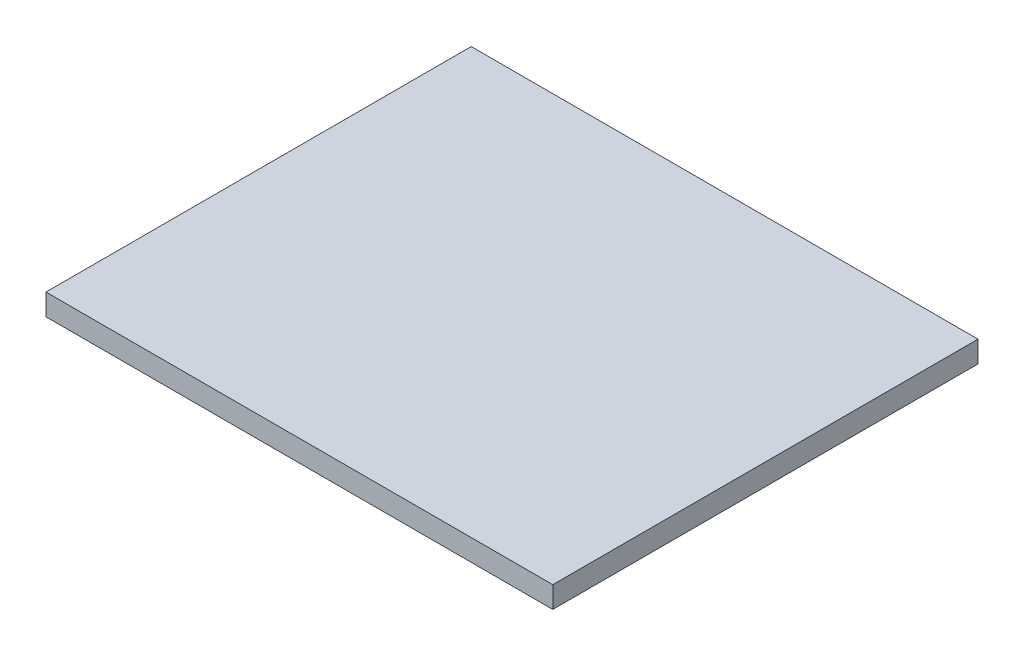
ISO-10303-21;
HEADER;
FILE_DESCRIPTION(('STEP AP214'),'2;1');
FILE_NAME('part.step','',(''),(''),'','','');
FILE_SCHEMA(('AUTOMOTIVE_DESIGN { 1 0 10303 214 1 1 1 1 }'));
ENDSEC;
DATA;
#1=APPLICATION_CONTEXT('core data for automotive mechanical design processes');
#2=APPLICATION_PROTOCOL_DEFINITION('international standard','automotive_design',2000,#1);
#3=PRODUCT_CONTEXT('',#1,'mechanical');
#4=PRODUCT('Part','Part','',(#3));
#5=PRODUCT_RELATED_PRODUCT_CATEGORY('part','',(#4));
#6=PRODUCT_DEFINITION_FORMATION('','',#4);
#7=PRODUCT_DEFINITION_CONTEXT('part definition',#1,'design');
#8=PRODUCT_DEFINITION('design','',#6,#7);
#9=PRODUCT_DEFINITION_SHAPE('','',#8);
#10=(LENGTH_UNIT() NAMED_UNIT(*) SI_UNIT(.MILLI.,.METRE.));
#11=(NAMED_UNIT(*) PLANE_ANGLE_UNIT() SI_UNIT($,.RADIAN.));
#12=(NAMED_UNIT(*) SI_UNIT($,.STERADIAN.) SOLID_ANGLE_UNIT());
#13=UNCERTAINTY_MEASURE_WITH_UNIT(LENGTH_MEASURE(1.E-05),#10,'distance_accuracy_value','');
#14=(GEOMETRIC_REPRESENTATION_CONTEXT(3) GLOBAL_UNCERTAINTY_ASSIGNED_CONTEXT((#13)) GLOBAL_UNIT_ASSIGNED_CONTEXT((#10,
#11,#12)) REPRESENTATION_CONTEXT('',''));
#15=CARTESIAN_POINT('',(0.,0.,0.));
#16=DIRECTION('',(0.,0.,1.));
#17=DIRECTION('',(1.,0.,0.));
#18=AXIS2_PLACEMENT_3D('',#15,#16,#17);
#19=CARTESIAN_POINT('',(0.,0.,0.));
#20=DIRECTION('',(0.,1.,0.));
#21=DIRECTION('',(0.,0.,1.));
#22=AXIS2_PLACEMENT_3D('',#19,#20,#21);
#23=PLANE('',#22);
#24=DIRECTION('',(0.,0.,-1.));
#25=VECTOR('',#24,1.);
#26=CARTESIAN_POINT('',(29.5,0.,-24.75));
#27=LINE('',#26,#25);
#28=CARTESIAN_POINT('',(29.5,0.,24.75));
#29=VERTEX_POINT('',#28);
#30=CARTESIAN_POINT('',(29.5,0.,-24.75));
#31=VERTEX_POINT('',#30);
#32=EDGE_CURVE('E142',#29,#31,#27,.T.);
#33=ORIENTED_EDGE('',*,*,#32,.F.);
#34=DIRECTION('',(1.,0.,0.));
#35=VECTOR('',#34,1.);
#36=CARTESIAN_POINT('',(-29.5,0.,24.75));
#37=LINE('',#36,#35);
#38=CARTESIAN_POINT('',(-29.5,0.,24.75));
#39=VERTEX_POINT('',#38);
#40=EDGE_CURVE('E148',#39,#29,#37,.T.);
#41=ORIENTED_EDGE('',*,*,#40,.F.);
#42=DIRECTION('',(0.,0.,1.));
#43=VECTOR('',#42,1.);
#44=CARTESIAN_POINT('',(-29.5,0.,-24.75));
#45=LINE('',#44,#43);
#46=CARTESIAN_POINT('',(-29.5,0.,-24.75));
#47=VERTEX_POINT('',#46);
#48=EDGE_CURVE('E146',#47,#39,#45,.T.);
#49=ORIENTED_EDGE('',*,*,#48,.F.);
#50=DIRECTION('',(-1.,0.,0.));
#51=VECTOR('',#50,1.);
#52=CARTESIAN_POINT('',(-29.5,0.,-24.75));
#53=LINE('',#52,#51);
#54=EDGE_CURVE('E124',#31,#47,#53,.T.);
#55=ORIENTED_EDGE('',*,*,#54,.F.);
#56=EDGE_LOOP('',(#33,#41,#49,#55));
#57=FACE_BOUND('',#56,.T.);
#58=DIRECTION('',(0.,0.,-1.));
#59=VECTOR('',#58,1.);
#60=CARTESIAN_POINT('',(-1.75,0.,2.43669858620224));
#61=LINE('',#60,#59);
#62=CARTESIAN_POINT('',(-1.75,0.,6.50000000000001));
#63=VERTEX_POINT('',#62);
#64=CARTESIAN_POINT('',(-1.75,0.,2.43669858620224));
#65=VERTEX_POINT('',#64);
#66=EDGE_CURVE('E53',#63,#65,#61,.T.);
#67=ORIENTED_EDGE('',*,*,#66,.F.);
#68=DIRECTION('',(1.,0.,0.));
#69=VECTOR('',#68,1.);
#70=CARTESIAN_POINT('',(0.,0.,6.50000000000001));
#71=LINE('',#70,#69);
#72=CARTESIAN_POINT('',(1.75,0.,6.50000000000001));
#73=VERTEX_POINT('',#72);
#74=EDGE_CURVE('E158',#63,#73,#71,.T.);
#75=ORIENTED_EDGE('',*,*,#74,.T.);
#76=DIRECTION('',(0.,0.,1.));
#77=VECTOR('',#76,1.);
#78=CARTESIAN_POINT('',(1.75,0.,2.43669858620224));
#79=LINE('',#78,#77);
#80=CARTESIAN_POINT('',(1.75,0.,2.43669858620224));
#81=VERTEX_POINT('',#80);
#82=EDGE_CURVE('E60',#81,#73,#79,.T.);
#83=ORIENTED_EDGE('',*,*,#82,.F.);
#84=CARTESIAN_POINT('',(0.,0.,0.));
#85=DIRECTION('',(0.,1.,0.));
#86=DIRECTION('',(0.,0.,1.));
#87=AXIS2_PLACEMENT_3D('',#84,#85,#86);
#88=CIRCLE('',#87,3.);
#89=EDGE_CURVE('E135',#81,#65,#88,.T.);
#90=ORIENTED_EDGE('',*,*,#89,.T.);
#91=EDGE_LOOP('',(#67,#75,#83,#90));
#92=FACE_BOUND('',#91,.T.);
#93=ADVANCED_FACE('F37',(#57,#92),#23,.F.);
#94=CARTESIAN_POINT('',(29.5,1.5,-24.75));
#95=DIRECTION('',(-1.,0.,0.));
#96=DIRECTION('',(0.,0.,1.));
#97=AXIS2_PLACEMENT_3D('',#94,#95,#96);
#98=PLANE('',#97);
#99=ORIENTED_EDGE('',*,*,#32,.T.);
#100=DIRECTION('',(0.,-1.,0.));
#101=VECTOR('',#100,1.);
#102=CARTESIAN_POINT('',(29.5,1.5,-24.75));
#103=LINE('',#102,#101);
#104=CARTESIAN_POINT('',(29.5,2.5,-24.75));
#105=VERTEX_POINT('',#104);
#106=EDGE_CURVE('E127',#105,#31,#103,.T.);
#107=ORIENTED_EDGE('',*,*,#106,.F.);
#108=DIRECTION('',(0.,0.,-1.));
#109=VECTOR('',#108,1.);
#110=CARTESIAN_POINT('',(29.5,2.5,83.8029423483707));
#111=LINE('',#110,#109);
#112=CARTESIAN_POINT('',(29.5,2.5,24.75));
#113=VERTEX_POINT('',#112);
#114=EDGE_CURVE('E115',#113,#105,#111,.T.);
#115=ORIENTED_EDGE('',*,*,#114,.F.);
#116=DIRECTION('',(0.,-1.,0.));
#117=VECTOR('',#116,1.);
#118=CARTESIAN_POINT('',(29.5,1.5,24.75));
#119=LINE('',#118,#117);
#120=EDGE_CURVE('E150',#113,#29,#119,.T.);
#121=ORIENTED_EDGE('',*,*,#120,.T.);
#122=EDGE_LOOP('',(#99,#107,#115,#121));
#123=FACE_BOUND('',#122,.T.);
#124=ADVANCED_FACE('F204',(#123),#98,.F.);
#125=CARTESIAN_POINT('',(-29.5,1.5,-24.75));
#126=DIRECTION('',(0.,0.,1.));
#127=DIRECTION('',(1.,0.,0.));
#128=AXIS2_PLACEMENT_3D('',#125,#126,#127);
#129=PLANE('',#128);
#130=DIRECTION('',(0.,-1.,0.));
#131=VECTOR('',#130,1.);
#132=CARTESIAN_POINT('',(-29.5,1.5,-24.75));
#133=LINE('',#132,#131);
#134=CARTESIAN_POINT('',(-29.5,2.5,-24.75));
#135=VERTEX_POINT('',#134);
#136=EDGE_CURVE('E122',#135,#47,#133,.T.);
#137=ORIENTED_EDGE('',*,*,#136,.F.);
#138=DIRECTION('',(1.,0.,0.));
#139=VECTOR('',#138,1.);
#140=CARTESIAN_POINT('',(-29.5,2.5,-24.75));
#141=LINE('',#140,#139);
#142=EDGE_CURVE('E108',#135,#105,#141,.T.);
#143=ORIENTED_EDGE('',*,*,#142,.T.);
#144=ORIENTED_EDGE('',*,*,#106,.T.);
#145=ORIENTED_EDGE('',*,*,#54,.T.);
#146=EDGE_LOOP('',(#137,#143,#144,#145));
#147=FACE_BOUND('',#146,.T.);
#148=ADVANCED_FACE('F123',(#147),#129,.F.);
#149=CARTESIAN_POINT('',(-29.5,1.5,-24.75));
#150=DIRECTION('',(1.,0.,0.));
#151=DIRECTION('',(0.,0.,-1.));
#152=AXIS2_PLACEMENT_3D('',#149,#150,#151);
#153=PLANE('',#152);
#154=ORIENTED_EDGE('',*,*,#48,.T.);
#155=DIRECTION('',(0.,-1.,0.));
#156=VECTOR('',#155,1.);
#157=CARTESIAN_POINT('',(-29.5,1.5,24.75));
#158=LINE('',#157,#156);
#159=CARTESIAN_POINT('',(-29.5,2.5,24.75));
#160=VERTEX_POINT('',#159);
#161=EDGE_CURVE('E128',#160,#39,#158,.T.);
#162=ORIENTED_EDGE('',*,*,#161,.F.);
#163=DIRECTION('',(0.,0.,-1.));
#164=VECTOR('',#163,1.);
#165=CARTESIAN_POINT('',(-29.5,2.5,83.8029423483707));
#166=LINE('',#165,#164);
#167=EDGE_CURVE('E112',#160,#135,#166,.T.);
#168=ORIENTED_EDGE('',*,*,#167,.T.);
#169=ORIENTED_EDGE('',*,*,#136,.T.);
#170=EDGE_LOOP('',(#154,#162,#168,#169));
#171=FACE_BOUND('',#170,.T.);
#172=ADVANCED_FACE('F131',(#171),#153,.F.);
#173=CARTESIAN_POINT('',(-29.5,1.5,24.75));
#174=DIRECTION('',(0.,0.,-1.));
#175=DIRECTION('',(-1.,0.,0.));
#176=AXIS2_PLACEMENT_3D('',#173,#174,#175);
#177=PLANE('',#176);
#178=ORIENTED_EDGE('',*,*,#120,.F.);
#179=DIRECTION('',(1.,0.,0.));
#180=VECTOR('',#179,1.);
#181=CARTESIAN_POINT('',(-29.5,2.5,24.75));
#182=LINE('',#181,#180);
#183=EDGE_CURVE('E119',#160,#113,#182,.T.);
#184=ORIENTED_EDGE('',*,*,#183,.F.);
#185=ORIENTED_EDGE('',*,*,#161,.T.);
#186=ORIENTED_EDGE('',*,*,#40,.T.);
#187=EDGE_LOOP('',(#178,#184,#185,#186));
#188=FACE_BOUND('',#187,.T.);
#189=ADVANCED_FACE('F200',(#188),#177,.F.);
#190=CARTESIAN_POINT('',(0.,1.5,0.));
#191=DIRECTION('',(0.,-1.,0.));
#192=DIRECTION('',(0.,0.,-1.));
#193=AXIS2_PLACEMENT_3D('',#190,#191,#192);
#194=CYLINDRICAL_SURFACE('',#193,3.);
#195=DIRECTION('',(0.,-1.,0.));
#196=VECTOR('',#195,1.);
#197=CARTESIAN_POINT('',(-1.75,2.,2.43669858620224));
#198=LINE('',#197,#196);
#199=CARTESIAN_POINT('',(-1.75,2.,2.43669858620224));
#200=VERTEX_POINT('',#199);
#201=EDGE_CURVE('E133',#200,#65,#198,.T.);
#202=ORIENTED_EDGE('',*,*,#201,.T.);
#203=ORIENTED_EDGE('',*,*,#89,.F.);
#204=DIRECTION('',(0.,-1.,0.));
#205=VECTOR('',#204,1.);
#206=CARTESIAN_POINT('',(1.75,2.,2.43669858620224));
#207=LINE('',#206,#205);
#208=CARTESIAN_POINT('',(1.75,2.,2.43669858620224));
#209=VERTEX_POINT('',#208);
#210=EDGE_CURVE('E172',#209,#81,#207,.T.);
#211=ORIENTED_EDGE('',*,*,#210,.F.);
#212=CARTESIAN_POINT('',(0.,2.,0.));
#213=DIRECTION('',(0.,-1.,0.));
#214=DIRECTION('',(0.,0.,-1.));
#215=AXIS2_PLACEMENT_3D('',#212,#213,#214);
#216=CIRCLE('',#215,3.);
#217=EDGE_CURVE('E175',#200,#209,#216,.T.);
#218=ORIENTED_EDGE('',*,*,#217,.F.);
#219=EDGE_LOOP('',(#202,#203,#211,#218));
#220=FACE_BOUND('',#219,.T.);
#221=ADVANCED_FACE('F170',(#220),#194,.F.);
#222=CARTESIAN_POINT('',(-1.75,2.,2.43669858620224));
#223=DIRECTION('',(-1.,0.,0.));
#224=DIRECTION('',(0.,0.,1.));
#225=AXIS2_PLACEMENT_3D('',#222,#223,#224);
#226=PLANE('',#225);
#227=ORIENTED_EDGE('',*,*,#66,.T.);
#228=ORIENTED_EDGE('',*,*,#201,.F.);
#229=DIRECTION('',(0.,0.,-1.));
#230=VECTOR('',#229,1.);
#231=CARTESIAN_POINT('',(-1.75,2.,2.43669858620224));
#232=LINE('',#231,#230);
#233=CARTESIAN_POINT('',(-1.75,2.,5.));
#234=VERTEX_POINT('',#233);
#235=EDGE_CURVE('E177',#234,#200,#232,.T.);
#236=ORIENTED_EDGE('',*,*,#235,.F.);
#237=DIRECTION('',(0.,-1.,0.));
#238=VECTOR('',#237,1.);
#239=CARTESIAN_POINT('',(-1.75,2.,5.));
#240=LINE('',#239,#238);
#241=CARTESIAN_POINT('',(-1.75,1.5,5.));
#242=VERTEX_POINT('',#241);
#243=EDGE_CURVE('E137',#234,#242,#240,.T.);
#244=ORIENTED_EDGE('',*,*,#243,.T.);
#245=DIRECTION('',(0.,0.707106781186546,-0.707106781186549));
#246=VECTOR('',#245,1.);
#247=CARTESIAN_POINT('',(-1.75,3.03165070689888,3.46834929310112));
#248=LINE('',#247,#246);
#249=EDGE_CURVE('E46',#242,#63,#248,.F.);
#250=ORIENTED_EDGE('',*,*,#249,.T.);
#251=EDGE_LOOP('',(#227,#228,#236,#244,#250));
#252=FACE_BOUND('',#251,.T.);
#253=ADVANCED_FACE('F162',(#252),#226,.F.);
#254=CARTESIAN_POINT('',(1.75,2.,5.));
#255=DIRECTION('',(0.,0.,1.));
#256=DIRECTION('',(1.,0.,0.));
#257=AXIS2_PLACEMENT_3D('',#254,#255,#256);
#258=PLANE('',#257);
#259=DIRECTION('',(0.,-1.,0.));
#260=VECTOR('',#259,1.);
#261=CARTESIAN_POINT('',(1.75,2.,5.));
#262=LINE('',#261,#260);
#263=CARTESIAN_POINT('',(1.75,2.,5.));
#264=VERTEX_POINT('',#263);
#265=CARTESIAN_POINT('',(1.75,1.5,5.));
#266=VERTEX_POINT('',#265);
#267=EDGE_CURVE('E182',#264,#266,#262,.T.);
#268=ORIENTED_EDGE('',*,*,#267,.T.);
#269=DIRECTION('',(-1.,0.,0.));
#270=VECTOR('',#269,1.);
#271=CARTESIAN_POINT('',(1.75,1.5,5.));
#272=LINE('',#271,#270);
#273=EDGE_CURVE('E155',#266,#242,#272,.T.);
#274=ORIENTED_EDGE('',*,*,#273,.T.);
#275=ORIENTED_EDGE('',*,*,#243,.F.);
#276=DIRECTION('',(-1.,0.,0.));
#277=VECTOR('',#276,1.);
#278=CARTESIAN_POINT('',(1.75,2.,5.));
#279=LINE('',#278,#277);
#280=EDGE_CURVE('E180',#264,#234,#279,.T.);
#281=ORIENTED_EDGE('',*,*,#280,.F.);
#282=EDGE_LOOP('',(#268,#274,#275,#281));
#283=FACE_BOUND('',#282,.T.);
#284=ADVANCED_FACE('F192',(#283),#258,.F.);
#285=CARTESIAN_POINT('',(1.75,2.,2.43669858620224));
#286=DIRECTION('',(1.,0.,0.));
#287=DIRECTION('',(0.,0.,-1.));
#288=AXIS2_PLACEMENT_3D('',#285,#286,#287);
#289=PLANE('',#288);
#290=ORIENTED_EDGE('',*,*,#82,.T.);
#291=DIRECTION('',(0.,-0.707106781186546,0.707106781186549));
#292=VECTOR('',#291,1.);
#293=CARTESIAN_POINT('',(1.75,3.03165070689888,3.46834929310112));
#294=LINE('',#293,#292);
#295=EDGE_CURVE('E11',#73,#266,#294,.F.);
#296=ORIENTED_EDGE('',*,*,#295,.T.);
#297=ORIENTED_EDGE('',*,*,#267,.F.);
#298=DIRECTION('',(0.,0.,1.));
#299=VECTOR('',#298,1.);
#300=CARTESIAN_POINT('',(1.75,2.,2.43669858620224));
#301=LINE('',#300,#299);
#302=EDGE_CURVE('E183',#209,#264,#301,.T.);
#303=ORIENTED_EDGE('',*,*,#302,.F.);
#304=ORIENTED_EDGE('',*,*,#210,.T.);
#305=EDGE_LOOP('',(#290,#296,#297,#303,#304));
#306=FACE_BOUND('',#305,.T.);
#307=ADVANCED_FACE('F194',(#306),#289,.F.);
#308=CARTESIAN_POINT('',(0.,2.,0.));
#309=DIRECTION('',(0.,-1.,0.));
#310=DIRECTION('',(0.,0.,-1.));
#311=AXIS2_PLACEMENT_3D('',#308,#309,#310);
#312=PLANE('',#311);
#313=ORIENTED_EDGE('',*,*,#217,.T.);
#314=ORIENTED_EDGE('',*,*,#302,.T.);
#315=ORIENTED_EDGE('',*,*,#280,.T.);
#316=ORIENTED_EDGE('',*,*,#235,.T.);
#317=EDGE_LOOP('',(#313,#314,#315,#316));
#318=FACE_BOUND('',#317,.T.);
#319=ADVANCED_FACE('F195',(#318),#312,.T.);
#320=CARTESIAN_POINT('',(1.75,1.5,5.));
#321=DIRECTION('',(0.,0.707106781186549,0.707106781186546));
#322=DIRECTION('',(-1.,0.,0.));
#323=AXIS2_PLACEMENT_3D('',#320,#321,#322);
#324=PLANE('',#323);
#325=ORIENTED_EDGE('',*,*,#295,.F.);
#326=ORIENTED_EDGE('',*,*,#74,.F.);
#327=ORIENTED_EDGE('',*,*,#249,.F.);
#328=ORIENTED_EDGE('',*,*,#273,.F.);
#329=EDGE_LOOP('',(#325,#326,#327,#328));
#330=FACE_BOUND('',#329,.T.);
#331=ADVANCED_FACE('F40',(#330),#324,.F.);
#332=CARTESIAN_POINT('',(-29.5,2.5,-24.75));
#333=DIRECTION('',(0.,-1.,0.));
#334=DIRECTION('',(0.,0.,-1.));
#335=AXIS2_PLACEMENT_3D('',#332,#333,#334);
#336=PLANE('',#335);
#337=ORIENTED_EDGE('',*,*,#183,.T.);
#338=ORIENTED_EDGE('',*,*,#114,.T.);
#339=ORIENTED_EDGE('',*,*,#142,.F.);
#340=ORIENTED_EDGE('',*,*,#167,.F.);
#341=EDGE_LOOP('',(#337,#338,#339,#340));
#342=FACE_BOUND('',#341,.T.);
#343=ADVANCED_FACE('F110',(#342),#336,.F.);
#344=CLOSED_SHELL('',(#93,#124,#148,#172,#189,#221,#253,#284,#307,#319,#331,#343));
#345=MANIFOLD_SOLID_BREP('B2',#344);
#346=ADVANCED_BREP_SHAPE_REPRESENTATION('',(#18,#345),#14);
#347=SHAPE_DEFINITION_REPRESENTATION(#9,#346);
ENDSEC;
END-ISO-10303-21;
